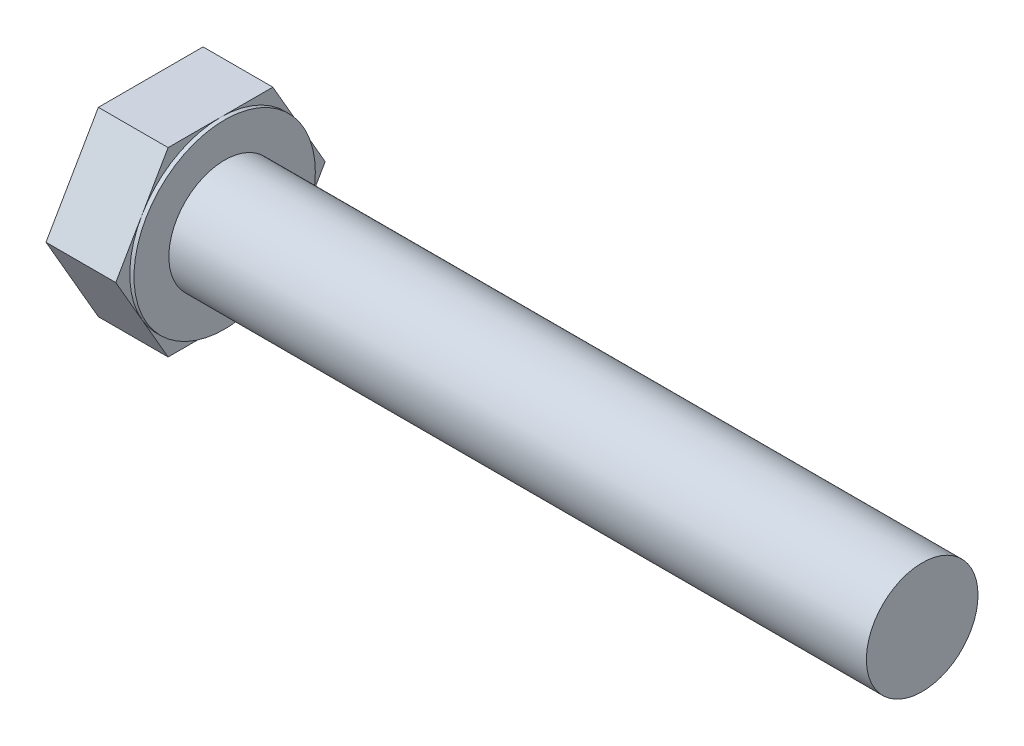
ISO-10303-21;
HEADER;
FILE_DESCRIPTION(('STEP AP214'),'2;1');
FILE_NAME('part.step','',(''),(''),'','','');
FILE_SCHEMA(('AUTOMOTIVE_DESIGN { 1 0 10303 214 1 1 1 1 }'));
ENDSEC;
DATA;
#1=APPLICATION_CONTEXT('core data for automotive mechanical design processes');
#2=APPLICATION_PROTOCOL_DEFINITION('international standard','automotive_design',2000,#1);
#3=PRODUCT_CONTEXT('',#1,'mechanical');
#4=PRODUCT('Part','Part','',(#3));
#5=PRODUCT_RELATED_PRODUCT_CATEGORY('part','',(#4));
#6=PRODUCT_DEFINITION_FORMATION('','',#4);
#7=PRODUCT_DEFINITION_CONTEXT('part definition',#1,'design');
#8=PRODUCT_DEFINITION('design','',#6,#7);
#9=PRODUCT_DEFINITION_SHAPE('','',#8);
#10=(LENGTH_UNIT() NAMED_UNIT(*) SI_UNIT(.MILLI.,.METRE.));
#11=(NAMED_UNIT(*) PLANE_ANGLE_UNIT() SI_UNIT($,.RADIAN.));
#12=(NAMED_UNIT(*) SI_UNIT($,.STERADIAN.) SOLID_ANGLE_UNIT());
#13=UNCERTAINTY_MEASURE_WITH_UNIT(LENGTH_MEASURE(1.E-05),#10,'distance_accuracy_value','');
#14=(GEOMETRIC_REPRESENTATION_CONTEXT(3) GLOBAL_UNCERTAINTY_ASSIGNED_CONTEXT((#13)) GLOBAL_UNIT_ASSIGNED_CONTEXT((#10,
#11,#12)) REPRESENTATION_CONTEXT('',''));
#15=CARTESIAN_POINT('',(0.,0.,0.));
#16=DIRECTION('',(0.,0.,1.));
#17=DIRECTION('',(1.,0.,0.));
#18=AXIS2_PLACEMENT_3D('',#15,#16,#17);
#19=CARTESIAN_POINT('',(0.3,0.,0.));
#20=DIRECTION('',(1.,0.,0.));
#21=DIRECTION('',(0.,0.,-1.));
#22=AXIS2_PLACEMENT_3D('',#19,#20,#21);
#23=PLANE('',#22);
#24=CARTESIAN_POINT('',(0.3,0.,0.));
#25=DIRECTION('',(1.,0.,0.));
#26=DIRECTION('',(0.,0.,-1.));
#27=AXIS2_PLACEMENT_3D('',#24,#25,#26);
#28=CIRCLE('',#27,6.50000000000004);
#29=CARTESIAN_POINT('',(0.3,0.,-6.50000000000004));
#30=VERTEX_POINT('',#29);
#31=EDGE_CURVE('E126',#30,#30,#28,.T.);
#32=ORIENTED_EDGE('',*,*,#31,.T.);
#33=EDGE_LOOP('',(#32));
#34=FACE_BOUND('',#33,.T.);
#35=CARTESIAN_POINT('',(0.3,0.,0.));
#36=DIRECTION('',(1.,0.,0.));
#37=DIRECTION('',(0.,0.,-1.));
#38=AXIS2_PLACEMENT_3D('',#35,#36,#37);
#39=CIRCLE('',#38,4.);
#40=CARTESIAN_POINT('',(0.3,0.,-4.));
#41=VERTEX_POINT('',#40);
#42=EDGE_CURVE('E349',#41,#41,#39,.T.);
#43=ORIENTED_EDGE('',*,*,#42,.F.);
#44=EDGE_LOOP('',(#43));
#45=FACE_BOUND('',#44,.T.);
#46=ADVANCED_FACE('F33',(#34,#45),#23,.T.);
#47=CARTESIAN_POINT('',(0.,0.,0.));
#48=DIRECTION('',(1.,0.,0.));
#49=DIRECTION('',(0.,0.,-1.));
#50=AXIS2_PLACEMENT_3D('',#47,#48,#49);
#51=PLANE('',#50);
#52=CARTESIAN_POINT('',(0.,0.,0.));
#53=DIRECTION('',(1.,0.,0.));
#54=DIRECTION('',(0.,0.,-1.));
#55=AXIS2_PLACEMENT_3D('',#52,#53,#54);
#56=CIRCLE('',#55,6.50000000000004);
#57=CARTESIAN_POINT('',(0.,3.25000000000007,-5.62916512459886));
#58=VERTEX_POINT('',#57);
#59=CARTESIAN_POINT('',(0.,6.5,0.));
#60=VERTEX_POINT('',#59);
#61=EDGE_CURVE('E44',#58,#60,#56,.T.);
#62=ORIENTED_EDGE('',*,*,#61,.F.);
#63=DIRECTION('',(0.,0.866025403784435,0.500000000000007));
#64=VECTOR('',#63,1.);
#65=CARTESIAN_POINT('',(0.,0.,-7.50555349946514));
#66=LINE('',#65,#64);
#67=CARTESIAN_POINT('',(0.,6.50000000000004,-3.75277674973251));
#68=VERTEX_POINT('',#67);
#69=EDGE_CURVE('E111',#58,#68,#66,.T.);
#70=ORIENTED_EDGE('',*,*,#69,.T.);
#71=DIRECTION('',(0.,0.,1.));
#72=VECTOR('',#71,1.);
#73=CARTESIAN_POINT('',(0.,6.50000000000004,-3.75277674973251));
#74=LINE('',#73,#72);
#75=EDGE_CURVE('E124',#68,#60,#74,.T.);
#76=ORIENTED_EDGE('',*,*,#75,.T.);
#77=EDGE_LOOP('',(#62,#70,#76));
#78=FACE_BOUND('',#77,.T.);
#79=ADVANCED_FACE('F123',(#78),#51,.T.);
#80=CARTESIAN_POINT('',(0.,3.24999999999998,5.62916512459889));
#81=VERTEX_POINT('',#80);
#82=EDGE_CURVE('E11',#60,#81,#56,.T.);
#83=ORIENTED_EDGE('',*,*,#82,.F.);
#84=CARTESIAN_POINT('',(0.,6.49999999999996,3.75277674973265));
#85=VERTEX_POINT('',#84);
#86=EDGE_CURVE('E110',#60,#85,#74,.T.);
#87=ORIENTED_EDGE('',*,*,#86,.T.);
#88=DIRECTION('',(0.,-0.866025403784442,0.499999999999995));
#89=VECTOR('',#88,1.);
#90=CARTESIAN_POINT('',(0.,6.49999999999996,3.75277674973265));
#91=LINE('',#90,#89);
#92=EDGE_CURVE('E156',#85,#81,#91,.T.);
#93=ORIENTED_EDGE('',*,*,#92,.T.);
#94=EDGE_LOOP('',(#83,#87,#93));
#95=FACE_BOUND('',#94,.T.);
#96=ADVANCED_FACE('F209',(#95),#51,.T.);
#97=CARTESIAN_POINT('',(0.,-3.25000000000001,5.62916512459885));
#98=VERTEX_POINT('',#97);
#99=EDGE_CURVE('E42',#81,#98,#56,.T.);
#100=ORIENTED_EDGE('',*,*,#99,.F.);
#101=CARTESIAN_POINT('',(0.,0.,7.50555349946514));
#102=VERTEX_POINT('',#101);
#103=EDGE_CURVE('E159',#81,#102,#91,.T.);
#104=ORIENTED_EDGE('',*,*,#103,.T.);
#105=DIRECTION('',(0.,-0.866025403784438,-0.500000000000001));
#106=VECTOR('',#105,1.);
#107=CARTESIAN_POINT('',(0.,0.,7.50555349946514));
#108=LINE('',#107,#106);
#109=EDGE_CURVE('E160',#102,#98,#108,.T.);
#110=ORIENTED_EDGE('',*,*,#109,.T.);
#111=EDGE_LOOP('',(#100,#104,#110));
#112=FACE_BOUND('',#111,.T.);
#113=ADVANCED_FACE('F190',(#112),#51,.T.);
#114=CARTESIAN_POINT('',(0.,-6.5,0.));
#115=VERTEX_POINT('',#114);
#116=EDGE_CURVE('E133',#98,#115,#56,.T.);
#117=ORIENTED_EDGE('',*,*,#116,.F.);
#118=CARTESIAN_POINT('',(0.,-6.50000000000001,3.75277674973255));
#119=VERTEX_POINT('',#118);
#120=EDGE_CURVE('E158',#98,#119,#108,.T.);
#121=ORIENTED_EDGE('',*,*,#120,.T.);
#122=DIRECTION('',(0.,0.,-1.));
#123=VECTOR('',#122,1.);
#124=CARTESIAN_POINT('',(0.,-6.50000000000001,3.75277674973255));
#125=LINE('',#124,#123);
#126=EDGE_CURVE('E164',#119,#115,#125,.T.);
#127=ORIENTED_EDGE('',*,*,#126,.T.);
#128=EDGE_LOOP('',(#117,#121,#127));
#129=FACE_BOUND('',#128,.T.);
#130=ADVANCED_FACE('F192',(#129),#51,.T.);
#131=CARTESIAN_POINT('',(0.,-3.24999999999997,-5.62916512459887));
#132=VERTEX_POINT('',#131);
#133=EDGE_CURVE('E131',#115,#132,#56,.T.);
#134=ORIENTED_EDGE('',*,*,#133,.F.);
#135=CARTESIAN_POINT('',(0.,-6.49999999999999,-3.7527767497326));
#136=VERTEX_POINT('',#135);
#137=EDGE_CURVE('E163',#115,#136,#125,.T.);
#138=ORIENTED_EDGE('',*,*,#137,.T.);
#139=DIRECTION('',(0.,0.866025403784442,-0.499999999999995));
#140=VECTOR('',#139,1.);
#141=CARTESIAN_POINT('',(0.,-6.49999999999999,-3.7527767497326));
#142=LINE('',#141,#140);
#143=EDGE_CURVE('E121',#136,#132,#142,.T.);
#144=ORIENTED_EDGE('',*,*,#143,.T.);
#145=EDGE_LOOP('',(#134,#138,#144));
#146=FACE_BOUND('',#145,.T.);
#147=ADVANCED_FACE('F199',(#146),#51,.T.);
#148=CARTESIAN_POINT('',(-5.,6.49999999999996,3.75277674973265));
#149=DIRECTION('',(0.,0.499999999999995,0.866025403784442));
#150=DIRECTION('',(0.,-0.866025403784442,0.499999999999995));
#151=AXIS2_PLACEMENT_3D('',#148,#149,#150);
#152=PLANE('',#151);
#153=ORIENTED_EDGE('',*,*,#92,.F.);
#154=DIRECTION('',(1.,0.,0.));
#155=VECTOR('',#154,1.);
#156=CARTESIAN_POINT('',(-5.,6.49999999999996,3.75277674973265));
#157=LINE('',#156,#155);
#158=CARTESIAN_POINT('',(-5.,6.49999999999996,3.75277674973265));
#159=VERTEX_POINT('',#158);
#160=EDGE_CURVE('E132',#159,#85,#157,.T.);
#161=ORIENTED_EDGE('',*,*,#160,.F.);
#162=DIRECTION('',(0.,-0.866025403784442,0.499999999999995));
#163=VECTOR('',#162,1.);
#164=CARTESIAN_POINT('',(-5.,6.49999999999996,3.75277674973265));
#165=LINE('',#164,#163);
#166=CARTESIAN_POINT('',(-5.,0.,7.50555349946514));
#167=VERTEX_POINT('',#166);
#168=EDGE_CURVE('E139',#159,#167,#165,.T.);
#169=ORIENTED_EDGE('',*,*,#168,.T.);
#170=DIRECTION('',(1.,0.,0.));
#171=VECTOR('',#170,1.);
#172=CARTESIAN_POINT('',(-5.,0.,7.50555349946514));
#173=LINE('',#172,#171);
#174=EDGE_CURVE('E37',#167,#102,#173,.T.);
#175=ORIENTED_EDGE('',*,*,#174,.T.);
#176=ORIENTED_EDGE('',*,*,#103,.F.);
#177=EDGE_LOOP('',(#153,#161,#169,#175,#176));
#178=FACE_BOUND('',#177,.T.);
#179=ADVANCED_FACE('F35',(#178),#152,.T.);
#180=CARTESIAN_POINT('',(-5.,6.50000000000004,-3.75277674973251));
#181=DIRECTION('',(0.,1.,0.));
#182=DIRECTION('',(0.,0.,1.));
#183=AXIS2_PLACEMENT_3D('',#180,#181,#182);
#184=PLANE('',#183);
#185=ORIENTED_EDGE('',*,*,#75,.F.);
#186=DIRECTION('',(1.,0.,0.));
#187=VECTOR('',#186,1.);
#188=CARTESIAN_POINT('',(-5.,6.50000000000004,-3.75277674973251));
#189=LINE('',#188,#187);
#190=CARTESIAN_POINT('',(-5.,6.50000000000004,-3.75277674973251));
#191=VERTEX_POINT('',#190);
#192=EDGE_CURVE('E117',#191,#68,#189,.T.);
#193=ORIENTED_EDGE('',*,*,#192,.F.);
#194=DIRECTION('',(0.,0.,1.));
#195=VECTOR('',#194,1.);
#196=CARTESIAN_POINT('',(-5.,6.50000000000004,-3.75277674973251));
#197=LINE('',#196,#195);
#198=EDGE_CURVE('E153',#191,#159,#197,.T.);
#199=ORIENTED_EDGE('',*,*,#198,.T.);
#200=ORIENTED_EDGE('',*,*,#160,.T.);
#201=ORIENTED_EDGE('',*,*,#86,.F.);
#202=EDGE_LOOP('',(#185,#193,#199,#200,#201));
#203=FACE_BOUND('',#202,.T.);
#204=ADVANCED_FACE('F208',(#203),#184,.T.);
#205=CARTESIAN_POINT('',(-5.,0.,-7.50555349946514));
#206=DIRECTION('',(0.,0.500000000000007,-0.866025403784435));
#207=DIRECTION('',(0.,0.866025403784435,0.500000000000007));
#208=AXIS2_PLACEMENT_3D('',#205,#206,#207);
#209=PLANE('',#208);
#210=CARTESIAN_POINT('',(0.,0.,-7.50555349946514));
#211=VERTEX_POINT('',#210);
#212=EDGE_CURVE('E104',#211,#58,#66,.T.);
#213=ORIENTED_EDGE('',*,*,#212,.F.);
#214=DIRECTION('',(1.,0.,0.));
#215=VECTOR('',#214,1.);
#216=CARTESIAN_POINT('',(-5.,0.,-7.50555349946514));
#217=LINE('',#216,#215);
#218=CARTESIAN_POINT('',(-5.,0.,-7.50555349946514));
#219=VERTEX_POINT('',#218);
#220=EDGE_CURVE('E171',#219,#211,#217,.T.);
#221=ORIENTED_EDGE('',*,*,#220,.F.);
#222=DIRECTION('',(0.,0.866025403784435,0.500000000000007));
#223=VECTOR('',#222,1.);
#224=CARTESIAN_POINT('',(-5.,0.,-7.50555349946514));
#225=LINE('',#224,#223);
#226=EDGE_CURVE('E151',#219,#191,#225,.T.);
#227=ORIENTED_EDGE('',*,*,#226,.T.);
#228=ORIENTED_EDGE('',*,*,#192,.T.);
#229=ORIENTED_EDGE('',*,*,#69,.F.);
#230=EDGE_LOOP('',(#213,#221,#227,#228,#229));
#231=FACE_BOUND('',#230,.T.);
#232=ADVANCED_FACE('F115',(#231),#209,.T.);
#233=CARTESIAN_POINT('',(-5.,-6.49999999999999,-3.7527767497326));
#234=DIRECTION('',(0.,-0.499999999999995,-0.866025403784442));
#235=DIRECTION('',(0.,0.866025403784442,-0.499999999999995));
#236=AXIS2_PLACEMENT_3D('',#233,#234,#235);
#237=PLANE('',#236);
#238=ORIENTED_EDGE('',*,*,#143,.F.);
#239=DIRECTION('',(1.,0.,0.));
#240=VECTOR('',#239,1.);
#241=CARTESIAN_POINT('',(-5.,-6.49999999999999,-3.7527767497326));
#242=LINE('',#241,#240);
#243=CARTESIAN_POINT('',(-5.,-6.49999999999999,-3.7527767497326));
#244=VERTEX_POINT('',#243);
#245=EDGE_CURVE('E173',#244,#136,#242,.T.);
#246=ORIENTED_EDGE('',*,*,#245,.F.);
#247=DIRECTION('',(0.,0.866025403784442,-0.499999999999995));
#248=VECTOR('',#247,1.);
#249=CARTESIAN_POINT('',(-5.,-6.49999999999999,-3.7527767497326));
#250=LINE('',#249,#248);
#251=EDGE_CURVE('E148',#244,#219,#250,.T.);
#252=ORIENTED_EDGE('',*,*,#251,.T.);
#253=ORIENTED_EDGE('',*,*,#220,.T.);
#254=EDGE_CURVE('E107',#132,#211,#142,.T.);
#255=ORIENTED_EDGE('',*,*,#254,.F.);
#256=EDGE_LOOP('',(#238,#246,#252,#253,#255));
#257=FACE_BOUND('',#256,.T.);
#258=ADVANCED_FACE('F201',(#257),#237,.T.);
#259=CARTESIAN_POINT('',(-5.,-6.50000000000001,3.75277674973255));
#260=DIRECTION('',(0.,-1.,0.));
#261=DIRECTION('',(0.,0.,-1.));
#262=AXIS2_PLACEMENT_3D('',#259,#260,#261);
#263=PLANE('',#262);
#264=ORIENTED_EDGE('',*,*,#126,.F.);
#265=DIRECTION('',(1.,0.,0.));
#266=VECTOR('',#265,1.);
#267=CARTESIAN_POINT('',(-5.,-6.50000000000001,3.75277674973255));
#268=LINE('',#267,#266);
#269=CARTESIAN_POINT('',(-5.,-6.50000000000001,3.75277674973255));
#270=VERTEX_POINT('',#269);
#271=EDGE_CURVE('E175',#270,#119,#268,.T.);
#272=ORIENTED_EDGE('',*,*,#271,.F.);
#273=DIRECTION('',(0.,0.,-1.));
#274=VECTOR('',#273,1.);
#275=CARTESIAN_POINT('',(-5.,-6.50000000000001,3.75277674973255));
#276=LINE('',#275,#274);
#277=EDGE_CURVE('E145',#270,#244,#276,.T.);
#278=ORIENTED_EDGE('',*,*,#277,.T.);
#279=ORIENTED_EDGE('',*,*,#245,.T.);
#280=ORIENTED_EDGE('',*,*,#137,.F.);
#281=EDGE_LOOP('',(#264,#272,#278,#279,#280));
#282=FACE_BOUND('',#281,.T.);
#283=ADVANCED_FACE('F195',(#282),#263,.T.);
#284=CARTESIAN_POINT('',(-5.,0.,7.50555349946514));
#285=DIRECTION('',(0.,-0.500000000000001,0.866025403784438));
#286=DIRECTION('',(0.,-0.866025403784438,-0.500000000000001));
#287=AXIS2_PLACEMENT_3D('',#284,#285,#286);
#288=PLANE('',#287);
#289=ORIENTED_EDGE('',*,*,#109,.F.);
#290=ORIENTED_EDGE('',*,*,#174,.F.);
#291=DIRECTION('',(0.,-0.866025403784438,-0.500000000000001));
#292=VECTOR('',#291,1.);
#293=CARTESIAN_POINT('',(-5.,0.,7.50555349946514));
#294=LINE('',#293,#292);
#295=EDGE_CURVE('E142',#167,#270,#294,.T.);
#296=ORIENTED_EDGE('',*,*,#295,.T.);
#297=ORIENTED_EDGE('',*,*,#271,.T.);
#298=ORIENTED_EDGE('',*,*,#120,.F.);
#299=EDGE_LOOP('',(#289,#290,#296,#297,#298));
#300=FACE_BOUND('',#299,.T.);
#301=ADVANCED_FACE('F187',(#300),#288,.T.);
#302=CARTESIAN_POINT('',(-5.,0.,0.));
#303=DIRECTION('',(1.,0.,0.));
#304=DIRECTION('',(0.,0.,-1.));
#305=AXIS2_PLACEMENT_3D('',#302,#303,#304);
#306=PLANE('',#305);
#307=ORIENTED_EDGE('',*,*,#168,.F.);
#308=ORIENTED_EDGE('',*,*,#198,.F.);
#309=ORIENTED_EDGE('',*,*,#226,.F.);
#310=ORIENTED_EDGE('',*,*,#251,.F.);
#311=ORIENTED_EDGE('',*,*,#277,.F.);
#312=ORIENTED_EDGE('',*,*,#295,.F.);
#313=EDGE_LOOP('',(#307,#308,#309,#310,#311,#312));
#314=FACE_BOUND('',#313,.T.);
#315=ADVANCED_FACE('F206',(#314),#306,.F.);
#316=EDGE_CURVE('E57',#132,#58,#56,.T.);
#317=ORIENTED_EDGE('',*,*,#316,.F.);
#318=ORIENTED_EDGE('',*,*,#254,.T.);
#319=ORIENTED_EDGE('',*,*,#212,.T.);
#320=EDGE_LOOP('',(#317,#318,#319));
#321=FACE_BOUND('',#320,.T.);
#322=ADVANCED_FACE('F106',(#321),#51,.T.);
#323=CARTESIAN_POINT('',(0.3,0.,0.));
#324=DIRECTION('',(-1.,0.,0.));
#325=DIRECTION('',(0.,0.,1.));
#326=AXIS2_PLACEMENT_3D('',#323,#324,#325);
#327=CYLINDRICAL_SURFACE('',#326,6.50000000000004);
#328=ORIENTED_EDGE('',*,*,#31,.F.);
#329=EDGE_LOOP('',(#328));
#330=FACE_BOUND('',#329,.T.);
#331=ORIENTED_EDGE('',*,*,#61,.T.);
#332=ORIENTED_EDGE('',*,*,#82,.T.);
#333=ORIENTED_EDGE('',*,*,#99,.T.);
#334=ORIENTED_EDGE('',*,*,#116,.T.);
#335=ORIENTED_EDGE('',*,*,#133,.T.);
#336=ORIENTED_EDGE('',*,*,#316,.T.);
#337=EDGE_LOOP('',(#331,#332,#333,#334,#335,#336));
#338=FACE_BOUND('',#337,.T.);
#339=ADVANCED_FACE('F129',(#330,#338),#327,.T.);
#340=CARTESIAN_POINT('',(50.3,0.,0.));
#341=DIRECTION('',(-1.,0.,0.));
#342=DIRECTION('',(0.,0.,1.));
#343=AXIS2_PLACEMENT_3D('',#340,#341,#342);
#344=CYLINDRICAL_SURFACE('',#343,4.);
#345=CARTESIAN_POINT('',(50.3,0.,0.));
#346=DIRECTION('',(1.,0.,0.));
#347=DIRECTION('',(0.,0.,-1.));
#348=AXIS2_PLACEMENT_3D('',#345,#346,#347);
#349=CIRCLE('',#348,4.);
#350=CARTESIAN_POINT('',(50.3,0.,-4.));
#351=VERTEX_POINT('',#350);
#352=EDGE_CURVE('E127',#351,#351,#349,.T.);
#353=ORIENTED_EDGE('',*,*,#352,.F.);
#354=EDGE_LOOP('',(#353));
#355=FACE_BOUND('',#354,.T.);
#356=ORIENTED_EDGE('',*,*,#42,.T.);
#357=EDGE_LOOP('',(#356));
#358=FACE_BOUND('',#357,.T.);
#359=ADVANCED_FACE('F227',(#355,#358),#344,.T.);
#360=CARTESIAN_POINT('',(50.3,0.,0.));
#361=DIRECTION('',(1.,0.,0.));
#362=DIRECTION('',(0.,0.,-1.));
#363=AXIS2_PLACEMENT_3D('',#360,#361,#362);
#364=PLANE('',#363);
#365=ORIENTED_EDGE('',*,*,#352,.T.);
#366=EDGE_LOOP('',(#365));
#367=FACE_BOUND('',#366,.T.);
#368=ADVANCED_FACE('F335',(#367),#364,.T.);
#369=CLOSED_SHELL('',(#46,#79,#96,#113,#130,#147,#179,#204,#232,#258,#283,#301,#315,#322,#339,
#359,#368));
#370=MANIFOLD_SOLID_BREP('B2',#369);
#371=ADVANCED_BREP_SHAPE_REPRESENTATION('',(#18,#370),#14);
#372=SHAPE_DEFINITION_REPRESENTATION(#9,#371);
ENDSEC;
END-ISO-10303-21;
